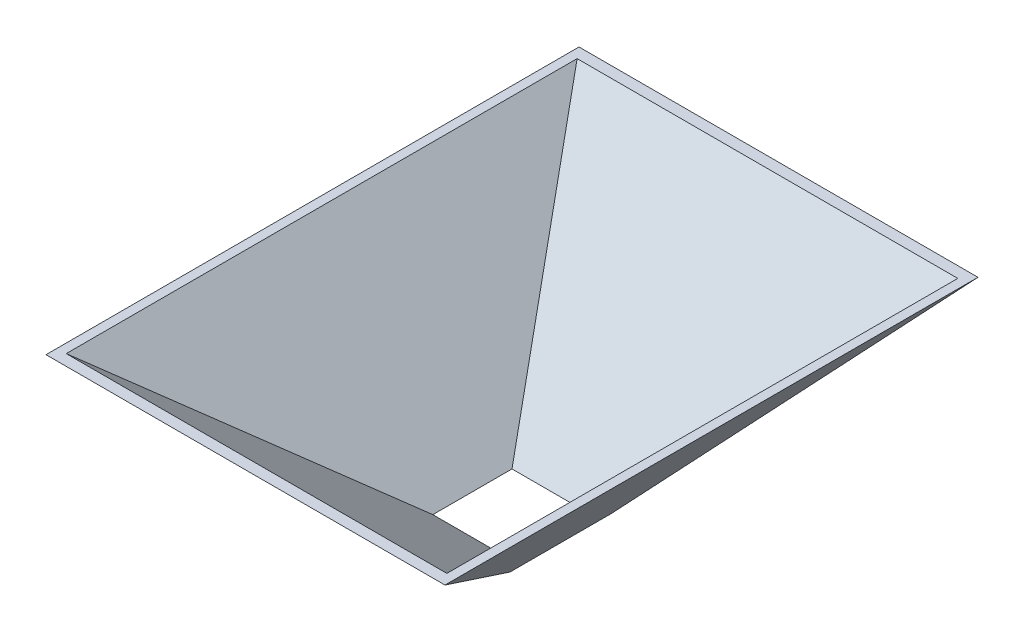
ISO-10303-21;
HEADER;
FILE_DESCRIPTION(('STEP AP214'),'2;1');
FILE_NAME('part.step','',(''),(''),'','','');
FILE_SCHEMA(('AUTOMOTIVE_DESIGN { 1 0 10303 214 1 1 1 1 }'));
ENDSEC;
DATA;
#1=APPLICATION_CONTEXT('core data for automotive mechanical design processes');
#2=APPLICATION_PROTOCOL_DEFINITION('international standard','automotive_design',2000,#1);
#3=PRODUCT_CONTEXT('',#1,'mechanical');
#4=PRODUCT('Part','Part','',(#3));
#5=PRODUCT_RELATED_PRODUCT_CATEGORY('part','',(#4));
#6=PRODUCT_DEFINITION_FORMATION('','',#4);
#7=PRODUCT_DEFINITION_CONTEXT('part definition',#1,'design');
#8=PRODUCT_DEFINITION('design','',#6,#7);
#9=PRODUCT_DEFINITION_SHAPE('','',#8);
#10=(LENGTH_UNIT() NAMED_UNIT(*) SI_UNIT(.MILLI.,.METRE.));
#11=(NAMED_UNIT(*) PLANE_ANGLE_UNIT() SI_UNIT($,.RADIAN.));
#12=(NAMED_UNIT(*) SI_UNIT($,.STERADIAN.) SOLID_ANGLE_UNIT());
#13=UNCERTAINTY_MEASURE_WITH_UNIT(LENGTH_MEASURE(1.E-05),#10,'distance_accuracy_value','');
#14=(GEOMETRIC_REPRESENTATION_CONTEXT(3) GLOBAL_UNCERTAINTY_ASSIGNED_CONTEXT((#13)) GLOBAL_UNIT_ASSIGNED_CONTEXT((#10,
#11,#12)) REPRESENTATION_CONTEXT('',''));
#15=CARTESIAN_POINT('',(0.,0.,0.));
#16=DIRECTION('',(0.,0.,1.));
#17=DIRECTION('',(1.,0.,0.));
#18=AXIS2_PLACEMENT_3D('',#15,#16,#17);
#19=CARTESIAN_POINT('',(-625.,50.,-890.));
#20=DIRECTION('',(0.,-1.,0.));
#21=DIRECTION('',(0.,0.,-1.));
#22=AXIS2_PLACEMENT_3D('',#19,#20,#21);
#23=PLANE('',#22);
#24=DIRECTION('',(0.,0.,-1.));
#25=VECTOR('',#24,1.);
#26=CARTESIAN_POINT('',(57.9808473356072,50.,-890.));
#27=LINE('',#26,#25);
#28=CARTESIAN_POINT('',(57.980847335607,49.9999999999999,77.4593768865621));
#29=VERTEX_POINT('',#28);
#30=CARTESIAN_POINT('',(57.980847335607,49.9999999999999,-77.4593768865622));
#31=VERTEX_POINT('',#30);
#32=EDGE_CURVE('E197',#29,#31,#27,.T.);
#33=ORIENTED_EDGE('',*,*,#32,.T.);
#34=DIRECTION('',(-1.,0.,0.));
#35=VECTOR('',#34,1.);
#36=CARTESIAN_POINT('',(-625.,49.9999999999999,-77.4593768865621));
#37=LINE('',#36,#35);
#38=CARTESIAN_POINT('',(-57.9808473356072,49.9999999999999,-77.4593768865621));
#39=VERTEX_POINT('',#38);
#40=EDGE_CURVE('E12',#31,#39,#37,.T.);
#41=ORIENTED_EDGE('',*,*,#40,.T.);
#42=DIRECTION('',(0.,0.,1.));
#43=VECTOR('',#42,1.);
#44=CARTESIAN_POINT('',(-57.9808473356072,49.9999999999998,890.));
#45=LINE('',#44,#43);
#46=CARTESIAN_POINT('',(-57.9808473356072,49.9999999999999,77.459376886562));
#47=VERTEX_POINT('',#46);
#48=EDGE_CURVE('E165',#39,#47,#45,.T.);
#49=ORIENTED_EDGE('',*,*,#48,.T.);
#50=DIRECTION('',(1.,0.,0.));
#51=VECTOR('',#50,1.);
#52=CARTESIAN_POINT('',(625.,50.,77.4593768865622));
#53=LINE('',#52,#51);
#54=EDGE_CURVE('E198',#47,#29,#53,.T.);
#55=ORIENTED_EDGE('',*,*,#54,.T.);
#56=EDGE_LOOP('',(#33,#41,#49,#55));
#57=FACE_BOUND('',#56,.T.);
#58=DIRECTION('',(0.,0.,-1.));
#59=VECTOR('',#58,1.);
#60=CARTESIAN_POINT('',(55.3214285714284,50.,-890.));
#61=LINE('',#60,#59);
#62=CARTESIAN_POINT('',(55.3214285714285,50.,74.25));
#63=VERTEX_POINT('',#62);
#64=CARTESIAN_POINT('',(55.3214285714286,50.,-74.25));
#65=VERTEX_POINT('',#64);
#66=EDGE_CURVE('E174',#63,#65,#61,.T.);
#67=ORIENTED_EDGE('',*,*,#66,.F.);
#68=DIRECTION('',(1.,0.,0.));
#69=VECTOR('',#68,1.);
#70=CARTESIAN_POINT('',(625.,50.,74.2499999999999));
#71=LINE('',#70,#69);
#72=CARTESIAN_POINT('',(-55.3214285714285,49.9999999999999,74.2499999999999));
#73=VERTEX_POINT('',#72);
#74=EDGE_CURVE('E172',#73,#63,#71,.T.);
#75=ORIENTED_EDGE('',*,*,#74,.F.);
#76=DIRECTION('',(0.,0.,1.));
#77=VECTOR('',#76,1.);
#78=CARTESIAN_POINT('',(-55.3214285714285,49.9999999999998,890.));
#79=LINE('',#78,#77);
#80=CARTESIAN_POINT('',(-55.3214285714285,50.,-74.2499999999999));
#81=VERTEX_POINT('',#80);
#82=EDGE_CURVE('E169',#81,#73,#79,.T.);
#83=ORIENTED_EDGE('',*,*,#82,.F.);
#84=DIRECTION('',(-1.,0.,0.));
#85=VECTOR('',#84,1.);
#86=CARTESIAN_POINT('',(-625.,49.9999999999999,-74.2499999999999));
#87=LINE('',#86,#85);
#88=EDGE_CURVE('E156',#65,#81,#87,.T.);
#89=ORIENTED_EDGE('',*,*,#88,.F.);
#90=EDGE_LOOP('',(#67,#75,#83,#89));
#91=FACE_BOUND('',#90,.T.);
#92=ADVANCED_FACE('F89',(#57,#91),#23,.F.);
#93=CARTESIAN_POINT('',(626.504088056337,698.681774253482,-890.));
#94=DIRECTION('',(0.752044028168583,-0.65911287325918,0.));
#95=DIRECTION('',(0.,0.,1.));
#96=AXIS2_PLACEMENT_3D('',#93,#94,#95);
#97=PLANE('',#96);
#98=ORIENTED_EDGE('',*,*,#32,.F.);
#99=DIRECTION('',(-0.479334251304998,-0.546917646150772,-0.686381645919219));
#100=VECTOR('',#99,1.);
#101=CARTESIAN_POINT('',(40.3613885949282,29.896298095395,52.2292309962831));
#102=LINE('',#101,#100);
#103=CARTESIAN_POINT('',(14.1594187641785,0.,14.7093768865623));
#104=VERTEX_POINT('',#103);
#105=EDGE_CURVE('E98',#29,#104,#102,.T.);
#106=ORIENTED_EDGE('',*,*,#105,.T.);
#107=DIRECTION('',(0.,0.,1.));
#108=VECTOR('',#107,1.);
#109=CARTESIAN_POINT('',(14.1594187641785,0.,0.));
#110=LINE('',#109,#108);
#111=CARTESIAN_POINT('',(14.1594187641785,0.,-14.7093768865624));
#112=VERTEX_POINT('',#111);
#113=EDGE_CURVE('E194',#112,#104,#110,.T.);
#114=ORIENTED_EDGE('',*,*,#113,.F.);
#115=DIRECTION('',(-0.479334251304998,-0.546917646150772,0.686381645919219));
#116=VECTOR('',#115,1.);
#117=CARTESIAN_POINT('',(338.790826596277,370.402584323502,-479.564620212558));
#118=LINE('',#117,#116);
#119=EDGE_CURVE('E191',#31,#112,#118,.T.);
#120=ORIENTED_EDGE('',*,*,#119,.F.);
#121=EDGE_LOOP('',(#98,#106,#114,#120));
#122=FACE_BOUND('',#121,.T.);
#123=ADVANCED_FACE('F219',(#122),#97,.T.);
#124=CARTESIAN_POINT('',(625.,698.43583344137,891.246347855482));
#125=DIRECTION('',(0.,-0.782083279314885,0.623173927740944));
#126=DIRECTION('',(-1.,0.,0.));
#127=AXIS2_PLACEMENT_3D('',#124,#125,#126);
#128=PLANE('',#127);
#129=ORIENTED_EDGE('',*,*,#54,.F.);
#130=DIRECTION('',(0.479334251304998,-0.546917646150772,-0.686381645919219));
#131=VECTOR('',#130,1.);
#132=CARTESIAN_POINT('',(-338.790826596277,370.402584323503,479.564620212558));
#133=LINE('',#132,#131);
#134=CARTESIAN_POINT('',(-14.1594187641787,0.,14.7093768865623));
#135=VERTEX_POINT('',#134);
#136=EDGE_CURVE('E190',#47,#135,#133,.T.);
#137=ORIENTED_EDGE('',*,*,#136,.T.);
#138=DIRECTION('',(-1.,0.,0.));
#139=VECTOR('',#138,1.);
#140=CARTESIAN_POINT('',(0.,0.,14.7093768865623));
#141=LINE('',#140,#139);
#142=EDGE_CURVE('E204',#104,#135,#141,.T.);
#143=ORIENTED_EDGE('',*,*,#142,.F.);
#144=ORIENTED_EDGE('',*,*,#105,.F.);
#145=EDGE_LOOP('',(#129,#137,#143,#144));
#146=FACE_BOUND('',#145,.T.);
#147=ADVANCED_FACE('F224',(#146),#128,.T.);
#148=CARTESIAN_POINT('',(-626.504088056337,698.681774253482,890.));
#149=DIRECTION('',(-0.752044028168583,-0.65911287325918,0.));
#150=DIRECTION('',(0.,0.,-1.));
#151=AXIS2_PLACEMENT_3D('',#148,#149,#150);
#152=PLANE('',#151);
#153=ORIENTED_EDGE('',*,*,#48,.F.);
#154=DIRECTION('',(0.479334251304998,-0.546917646150772,0.686381645919219));
#155=VECTOR('',#154,1.);
#156=CARTESIAN_POINT('',(-40.3613885949287,29.8962980953952,-52.2292309962831));
#157=LINE('',#156,#155);
#158=CARTESIAN_POINT('',(-14.1594187641787,0.,-14.7093768865624));
#159=VERTEX_POINT('',#158);
#160=EDGE_CURVE('E193',#39,#159,#157,.T.);
#161=ORIENTED_EDGE('',*,*,#160,.T.);
#162=DIRECTION('',(0.,0.,-1.));
#163=VECTOR('',#162,1.);
#164=CARTESIAN_POINT('',(-14.1594187641786,0.,0.));
#165=LINE('',#164,#163);
#166=EDGE_CURVE('E206',#135,#159,#165,.T.);
#167=ORIENTED_EDGE('',*,*,#166,.F.);
#168=ORIENTED_EDGE('',*,*,#136,.F.);
#169=EDGE_LOOP('',(#153,#161,#167,#168));
#170=FACE_BOUND('',#169,.T.);
#171=ADVANCED_FACE('F228',(#170),#152,.T.);
#172=CARTESIAN_POINT('',(-625.,698.43583344137,-891.246347855482));
#173=DIRECTION('',(0.,-0.782083279314885,-0.623173927740944));
#174=DIRECTION('',(1.,0.,0.));
#175=AXIS2_PLACEMENT_3D('',#172,#173,#174);
#176=PLANE('',#175);
#177=ORIENTED_EDGE('',*,*,#40,.F.);
#178=ORIENTED_EDGE('',*,*,#119,.T.);
#179=DIRECTION('',(1.,0.,0.));
#180=VECTOR('',#179,1.);
#181=CARTESIAN_POINT('',(0.,0.,-14.7093768865623));
#182=LINE('',#181,#180);
#183=EDGE_CURVE('E93',#159,#112,#182,.T.);
#184=ORIENTED_EDGE('',*,*,#183,.F.);
#185=ORIENTED_EDGE('',*,*,#160,.F.);
#186=EDGE_LOOP('',(#177,#178,#184,#185));
#187=FACE_BOUND('',#186,.T.);
#188=ADVANCED_FACE('F91',(#187),#176,.T.);
#189=CARTESIAN_POINT('',(0.,0.,0.));
#190=DIRECTION('',(0.,-1.,0.));
#191=DIRECTION('',(0.,0.,-1.));
#192=AXIS2_PLACEMENT_3D('',#189,#190,#191);
#193=PLANE('',#192);
#194=DIRECTION('',(0.,0.,1.));
#195=VECTOR('',#194,1.);
#196=CARTESIAN_POINT('',(11.5,0.,0.));
#197=LINE('',#196,#195);
#198=CARTESIAN_POINT('',(11.5,0.,-11.5));
#199=VERTEX_POINT('',#198);
#200=CARTESIAN_POINT('',(11.5,0.,11.5));
#201=VERTEX_POINT('',#200);
#202=EDGE_CURVE('E182',#199,#201,#197,.T.);
#203=ORIENTED_EDGE('',*,*,#202,.F.);
#204=DIRECTION('',(1.,0.,0.));
#205=VECTOR('',#204,1.);
#206=CARTESIAN_POINT('',(0.,0.,-11.5));
#207=LINE('',#206,#205);
#208=CARTESIAN_POINT('',(-11.5,0.,-11.5));
#209=VERTEX_POINT('',#208);
#210=EDGE_CURVE('E178',#209,#199,#207,.T.);
#211=ORIENTED_EDGE('',*,*,#210,.F.);
#212=DIRECTION('',(0.,0.,-1.));
#213=VECTOR('',#212,1.);
#214=CARTESIAN_POINT('',(-11.5,0.,0.));
#215=LINE('',#214,#213);
#216=CARTESIAN_POINT('',(-11.5,0.,11.5));
#217=VERTEX_POINT('',#216);
#218=EDGE_CURVE('E106',#217,#209,#215,.T.);
#219=ORIENTED_EDGE('',*,*,#218,.F.);
#220=DIRECTION('',(-1.,0.,0.));
#221=VECTOR('',#220,1.);
#222=CARTESIAN_POINT('',(0.,0.,11.5));
#223=LINE('',#222,#221);
#224=EDGE_CURVE('E185',#201,#217,#223,.T.);
#225=ORIENTED_EDGE('',*,*,#224,.F.);
#226=EDGE_LOOP('',(#203,#211,#219,#225));
#227=FACE_BOUND('',#226,.T.);
#228=ORIENTED_EDGE('',*,*,#113,.T.);
#229=ORIENTED_EDGE('',*,*,#142,.T.);
#230=ORIENTED_EDGE('',*,*,#166,.T.);
#231=ORIENTED_EDGE('',*,*,#183,.T.);
#232=EDGE_LOOP('',(#228,#229,#230,#231));
#233=FACE_BOUND('',#232,.T.);
#234=ADVANCED_FACE('F213',(#227,#233),#193,.T.);
#235=CARTESIAN_POINT('',(625.,700.,-890.));
#236=DIRECTION('',(0.752044028168583,-0.65911287325918,0.));
#237=DIRECTION('',(0.,0.,1.));
#238=AXIS2_PLACEMENT_3D('',#235,#236,#237);
#239=PLANE('',#238);
#240=ORIENTED_EDGE('',*,*,#66,.T.);
#241=DIRECTION('',(-0.479334251304998,-0.546917646150772,0.686381645919219));
#242=VECTOR('',#241,1.);
#243=CARTESIAN_POINT('',(318.25,350.,-450.75));
#244=LINE('',#243,#242);
#245=EDGE_CURVE('E161',#65,#199,#244,.T.);
#246=ORIENTED_EDGE('',*,*,#245,.T.);
#247=ORIENTED_EDGE('',*,*,#202,.T.);
#248=DIRECTION('',(-0.479334251304998,-0.546917646150772,-0.686381645919219));
#249=VECTOR('',#248,1.);
#250=CARTESIAN_POINT('',(318.25,350.,450.75));
#251=LINE('',#250,#249);
#252=EDGE_CURVE('E166',#63,#201,#251,.T.);
#253=ORIENTED_EDGE('',*,*,#252,.F.);
#254=EDGE_LOOP('',(#240,#246,#247,#253));
#255=FACE_BOUND('',#254,.T.);
#256=ADVANCED_FACE('F241',(#255),#239,.F.);
#257=CARTESIAN_POINT('',(625.,700.,890.));
#258=DIRECTION('',(0.,-0.782083279314885,0.623173927740944));
#259=DIRECTION('',(-1.,0.,0.));
#260=AXIS2_PLACEMENT_3D('',#257,#258,#259);
#261=PLANE('',#260);
#262=ORIENTED_EDGE('',*,*,#74,.T.);
#263=ORIENTED_EDGE('',*,*,#252,.T.);
#264=ORIENTED_EDGE('',*,*,#224,.T.);
#265=DIRECTION('',(0.479334251304998,-0.546917646150772,-0.686381645919219));
#266=VECTOR('',#265,1.);
#267=CARTESIAN_POINT('',(-318.25,350.,450.75));
#268=LINE('',#267,#266);
#269=EDGE_CURVE('E113',#73,#217,#268,.T.);
#270=ORIENTED_EDGE('',*,*,#269,.F.);
#271=EDGE_LOOP('',(#262,#263,#264,#270));
#272=FACE_BOUND('',#271,.T.);
#273=ADVANCED_FACE('F261',(#272),#261,.F.);
#274=CARTESIAN_POINT('',(-625.,700.,890.));
#275=DIRECTION('',(-0.752044028168583,-0.65911287325918,0.));
#276=DIRECTION('',(0.,0.,-1.));
#277=AXIS2_PLACEMENT_3D('',#274,#275,#276);
#278=PLANE('',#277);
#279=ORIENTED_EDGE('',*,*,#82,.T.);
#280=ORIENTED_EDGE('',*,*,#269,.T.);
#281=ORIENTED_EDGE('',*,*,#218,.T.);
#282=DIRECTION('',(0.479334251304998,-0.546917646150772,0.686381645919219));
#283=VECTOR('',#282,1.);
#284=CARTESIAN_POINT('',(-318.25,350.,-450.75));
#285=LINE('',#284,#283);
#286=EDGE_CURVE('E159',#81,#209,#285,.T.);
#287=ORIENTED_EDGE('',*,*,#286,.F.);
#288=EDGE_LOOP('',(#279,#280,#281,#287));
#289=FACE_BOUND('',#288,.T.);
#290=ADVANCED_FACE('F168',(#289),#278,.F.);
#291=CARTESIAN_POINT('',(-625.,700.,-890.));
#292=DIRECTION('',(0.,-0.782083279314885,-0.623173927740944));
#293=DIRECTION('',(1.,0.,0.));
#294=AXIS2_PLACEMENT_3D('',#291,#292,#293);
#295=PLANE('',#294);
#296=ORIENTED_EDGE('',*,*,#88,.T.);
#297=ORIENTED_EDGE('',*,*,#286,.T.);
#298=ORIENTED_EDGE('',*,*,#210,.T.);
#299=ORIENTED_EDGE('',*,*,#245,.F.);
#300=EDGE_LOOP('',(#296,#297,#298,#299));
#301=FACE_BOUND('',#300,.T.);
#302=ADVANCED_FACE('F157',(#301),#295,.F.);
#303=CLOSED_SHELL('',(#92,#123,#147,#171,#188,#234,#256,#273,#290,#302));
#304=MANIFOLD_SOLID_BREP('B2',#303);
#305=ADVANCED_BREP_SHAPE_REPRESENTATION('',(#18,#304),#14);
#306=SHAPE_DEFINITION_REPRESENTATION(#9,#305);
ENDSEC;
END-ISO-10303-21;
